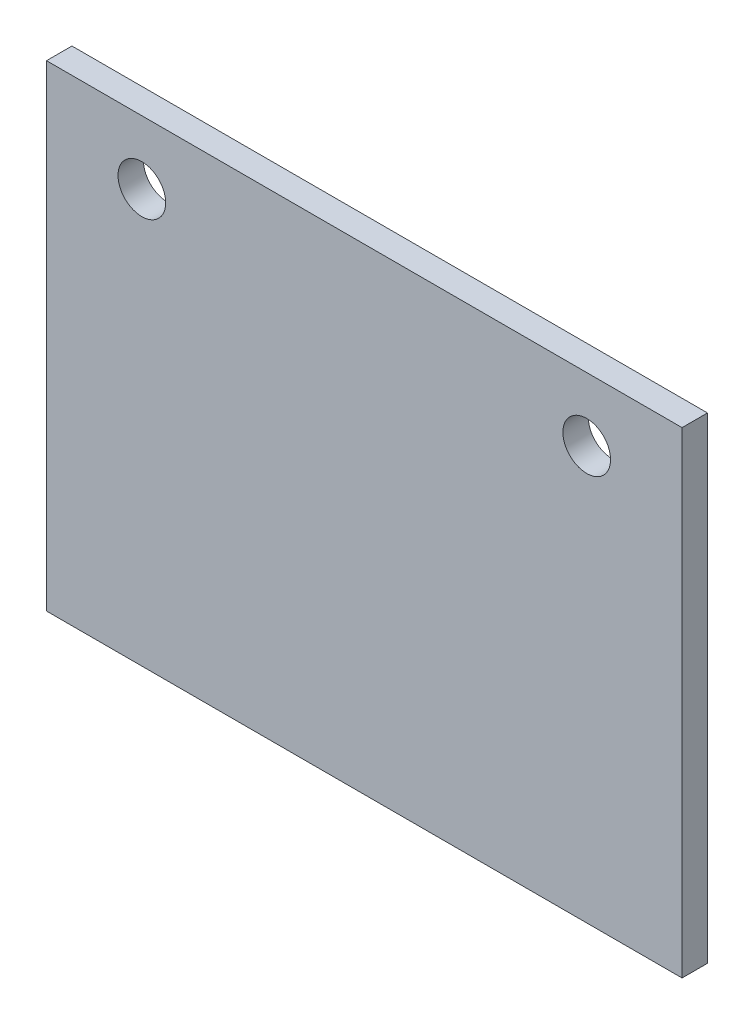
ISO-10303-21;
HEADER;
FILE_DESCRIPTION(('STEP AP214'),'2;1');
FILE_NAME('part.step','',(''),(''),'','','');
FILE_SCHEMA(('AUTOMOTIVE_DESIGN { 1 0 10303 214 1 1 1 1 }'));
ENDSEC;
DATA;
#1=APPLICATION_CONTEXT('core data for automotive mechanical design processes');
#2=APPLICATION_PROTOCOL_DEFINITION('international standard','automotive_design',2000,#1);
#3=PRODUCT_CONTEXT('',#1,'mechanical');
#4=PRODUCT('Part','Part','',(#3));
#5=PRODUCT_RELATED_PRODUCT_CATEGORY('part','',(#4));
#6=PRODUCT_DEFINITION_FORMATION('','',#4);
#7=PRODUCT_DEFINITION_CONTEXT('part definition',#1,'design');
#8=PRODUCT_DEFINITION('design','',#6,#7);
#9=PRODUCT_DEFINITION_SHAPE('','',#8);
#10=(LENGTH_UNIT() NAMED_UNIT(*) SI_UNIT(.MILLI.,.METRE.));
#11=(NAMED_UNIT(*) PLANE_ANGLE_UNIT() SI_UNIT($,.RADIAN.));
#12=(NAMED_UNIT(*) SI_UNIT($,.STERADIAN.) SOLID_ANGLE_UNIT());
#13=UNCERTAINTY_MEASURE_WITH_UNIT(LENGTH_MEASURE(1.E-05),#10,'distance_accuracy_value','');
#14=(GEOMETRIC_REPRESENTATION_CONTEXT(3) GLOBAL_UNCERTAINTY_ASSIGNED_CONTEXT((#13)) GLOBAL_UNIT_ASSIGNED_CONTEXT((#10,
#11,#12)) REPRESENTATION_CONTEXT('',''));
#15=CARTESIAN_POINT('',(0.,0.,0.));
#16=DIRECTION('',(0.,0.,1.));
#17=DIRECTION('',(1.,0.,0.));
#18=AXIS2_PLACEMENT_3D('',#15,#16,#17);
#19=CARTESIAN_POINT('',(0.,0.,1.6));
#20=DIRECTION('',(0.,0.,1.));
#21=DIRECTION('',(1.,0.,0.));
#22=AXIS2_PLACEMENT_3D('',#19,#20,#21);
#23=PLANE('',#22);
#24=CARTESIAN_POINT('',(-14.,11.,1.6));
#25=DIRECTION('',(0.,0.,1.));
#26=DIRECTION('',(1.,0.,0.));
#27=AXIS2_PLACEMENT_3D('',#24,#25,#26);
#28=CIRCLE('',#27,1.5);
#29=CARTESIAN_POINT('',(-12.5,11.,1.6));
#30=VERTEX_POINT('',#29);
#31=EDGE_CURVE('E102',#30,#30,#28,.T.);
#32=ORIENTED_EDGE('',*,*,#31,.F.);
#33=EDGE_LOOP('',(#32));
#34=FACE_BOUND('',#33,.T.);
#35=DIRECTION('',(0.,-1.,0.));
#36=VECTOR('',#35,1.);
#37=CARTESIAN_POINT('',(-20.,-15.,1.6));
#38=LINE('',#37,#36);
#39=CARTESIAN_POINT('',(-20.,15.,1.6));
#40=VERTEX_POINT('',#39);
#41=CARTESIAN_POINT('',(-20.,-15.,1.6));
#42=VERTEX_POINT('',#41);
#43=EDGE_CURVE('E87',#40,#42,#38,.T.);
#44=ORIENTED_EDGE('',*,*,#43,.T.);
#45=DIRECTION('',(1.,0.,0.));
#46=VECTOR('',#45,1.);
#47=CARTESIAN_POINT('',(20.,-15.,1.6));
#48=LINE('',#47,#46);
#49=CARTESIAN_POINT('',(20.,-15.,1.6));
#50=VERTEX_POINT('',#49);
#51=EDGE_CURVE('E82',#42,#50,#48,.T.);
#52=ORIENTED_EDGE('',*,*,#51,.T.);
#53=DIRECTION('',(0.,1.,0.));
#54=VECTOR('',#53,1.);
#55=CARTESIAN_POINT('',(20.,-15.,1.6));
#56=LINE('',#55,#54);
#57=CARTESIAN_POINT('',(20.,15.,1.6));
#58=VERTEX_POINT('',#57);
#59=EDGE_CURVE('E85',#50,#58,#56,.T.);
#60=ORIENTED_EDGE('',*,*,#59,.T.);
#61=DIRECTION('',(-1.,0.,0.));
#62=VECTOR('',#61,1.);
#63=CARTESIAN_POINT('',(20.,15.,1.6));
#64=LINE('',#63,#62);
#65=EDGE_CURVE('E52',#58,#40,#64,.T.);
#66=ORIENTED_EDGE('',*,*,#65,.T.);
#67=EDGE_LOOP('',(#44,#52,#60,#66));
#68=FACE_BOUND('',#67,.T.);
#69=CARTESIAN_POINT('',(14.,11.,1.6));
#70=DIRECTION('',(0.,0.,1.));
#71=DIRECTION('',(-1.,0.,0.));
#72=AXIS2_PLACEMENT_3D('',#69,#70,#71);
#73=CIRCLE('',#72,1.5);
#74=CARTESIAN_POINT('',(12.5,11.,1.6));
#75=VERTEX_POINT('',#74);
#76=EDGE_CURVE('E117',#75,#75,#73,.T.);
#77=ORIENTED_EDGE('',*,*,#76,.F.);
#78=EDGE_LOOP('',(#77));
#79=FACE_BOUND('',#78,.T.);
#80=ADVANCED_FACE('F35',(#34,#68,#79),#23,.T.);
#81=CARTESIAN_POINT('',(0.,0.,0.));
#82=DIRECTION('',(0.,0.,1.));
#83=DIRECTION('',(1.,0.,0.));
#84=AXIS2_PLACEMENT_3D('',#81,#82,#83);
#85=PLANE('',#84);
#86=DIRECTION('',(0.,-1.,0.));
#87=VECTOR('',#86,1.);
#88=CARTESIAN_POINT('',(-20.,-15.,0.));
#89=LINE('',#88,#87);
#90=CARTESIAN_POINT('',(-20.,15.,0.));
#91=VERTEX_POINT('',#90);
#92=CARTESIAN_POINT('',(-20.,-15.,0.));
#93=VERTEX_POINT('',#92);
#94=EDGE_CURVE('E99',#91,#93,#89,.T.);
#95=ORIENTED_EDGE('',*,*,#94,.F.);
#96=DIRECTION('',(-1.,0.,0.));
#97=VECTOR('',#96,1.);
#98=CARTESIAN_POINT('',(20.,15.,0.));
#99=LINE('',#98,#97);
#100=CARTESIAN_POINT('',(20.,15.,0.));
#101=VERTEX_POINT('',#100);
#102=EDGE_CURVE('E75',#101,#91,#99,.T.);
#103=ORIENTED_EDGE('',*,*,#102,.F.);
#104=DIRECTION('',(0.,1.,0.));
#105=VECTOR('',#104,1.);
#106=CARTESIAN_POINT('',(20.,-15.,0.));
#107=LINE('',#106,#105);
#108=CARTESIAN_POINT('',(20.,-15.,0.));
#109=VERTEX_POINT('',#108);
#110=EDGE_CURVE('E69',#109,#101,#107,.T.);
#111=ORIENTED_EDGE('',*,*,#110,.F.);
#112=DIRECTION('',(1.,0.,0.));
#113=VECTOR('',#112,1.);
#114=CARTESIAN_POINT('',(20.,-15.,0.));
#115=LINE('',#114,#113);
#116=EDGE_CURVE('E91',#93,#109,#115,.T.);
#117=ORIENTED_EDGE('',*,*,#116,.F.);
#118=EDGE_LOOP('',(#95,#103,#111,#117));
#119=FACE_BOUND('',#118,.T.);
#120=CARTESIAN_POINT('',(-14.,11.,0.));
#121=DIRECTION('',(0.,0.,1.));
#122=DIRECTION('',(1.,0.,0.));
#123=AXIS2_PLACEMENT_3D('',#120,#121,#122);
#124=CIRCLE('',#123,1.5);
#125=CARTESIAN_POINT('',(-12.5,11.,0.));
#126=VERTEX_POINT('',#125);
#127=EDGE_CURVE('E114',#126,#126,#124,.T.);
#128=ORIENTED_EDGE('',*,*,#127,.T.);
#129=EDGE_LOOP('',(#128));
#130=FACE_BOUND('',#129,.T.);
#131=CARTESIAN_POINT('',(14.,11.,0.));
#132=DIRECTION('',(0.,0.,1.));
#133=DIRECTION('',(-1.,0.,0.));
#134=AXIS2_PLACEMENT_3D('',#131,#132,#133);
#135=CIRCLE('',#134,1.5);
#136=CARTESIAN_POINT('',(12.5,11.,0.));
#137=VERTEX_POINT('',#136);
#138=EDGE_CURVE('E120',#137,#137,#135,.T.);
#139=ORIENTED_EDGE('',*,*,#138,.T.);
#140=EDGE_LOOP('',(#139));
#141=FACE_BOUND('',#140,.T.);
#142=ADVANCED_FACE('F110',(#119,#130,#141),#85,.F.);
#143=CARTESIAN_POINT('',(-20.,-15.,1.6));
#144=DIRECTION('',(1.,0.,0.));
#145=DIRECTION('',(0.,0.,-1.));
#146=AXIS2_PLACEMENT_3D('',#143,#144,#145);
#147=PLANE('',#146);
#148=ORIENTED_EDGE('',*,*,#94,.T.);
#149=DIRECTION('',(0.,0.,-1.));
#150=VECTOR('',#149,1.);
#151=CARTESIAN_POINT('',(-20.,-15.,1.6));
#152=LINE('',#151,#150);
#153=EDGE_CURVE('E11',#42,#93,#152,.T.);
#154=ORIENTED_EDGE('',*,*,#153,.F.);
#155=ORIENTED_EDGE('',*,*,#43,.F.);
#156=DIRECTION('',(0.,0.,-1.));
#157=VECTOR('',#156,1.);
#158=CARTESIAN_POINT('',(-20.,15.,1.6));
#159=LINE('',#158,#157);
#160=EDGE_CURVE('E95',#40,#91,#159,.T.);
#161=ORIENTED_EDGE('',*,*,#160,.T.);
#162=EDGE_LOOP('',(#148,#154,#155,#161));
#163=FACE_BOUND('',#162,.T.);
#164=ADVANCED_FACE('F37',(#163),#147,.F.);
#165=CARTESIAN_POINT('',(20.,-15.,1.6));
#166=DIRECTION('',(0.,1.,0.));
#167=DIRECTION('',(0.,0.,1.));
#168=AXIS2_PLACEMENT_3D('',#165,#166,#167);
#169=PLANE('',#168);
#170=ORIENTED_EDGE('',*,*,#116,.T.);
#171=DIRECTION('',(0.,0.,-1.));
#172=VECTOR('',#171,1.);
#173=CARTESIAN_POINT('',(20.,-15.,1.6));
#174=LINE('',#173,#172);
#175=EDGE_CURVE('E44',#50,#109,#174,.T.);
#176=ORIENTED_EDGE('',*,*,#175,.F.);
#177=ORIENTED_EDGE('',*,*,#51,.F.);
#178=ORIENTED_EDGE('',*,*,#153,.T.);
#179=EDGE_LOOP('',(#170,#176,#177,#178));
#180=FACE_BOUND('',#179,.T.);
#181=ADVANCED_FACE('F90',(#180),#169,.F.);
#182=CARTESIAN_POINT('',(20.,-15.,1.6));
#183=DIRECTION('',(-1.,0.,0.));
#184=DIRECTION('',(0.,0.,1.));
#185=AXIS2_PLACEMENT_3D('',#182,#183,#184);
#186=PLANE('',#185);
#187=ORIENTED_EDGE('',*,*,#110,.T.);
#188=DIRECTION('',(0.,0.,-1.));
#189=VECTOR('',#188,1.);
#190=CARTESIAN_POINT('',(20.,15.,1.6));
#191=LINE('',#190,#189);
#192=EDGE_CURVE('E92',#58,#101,#191,.T.);
#193=ORIENTED_EDGE('',*,*,#192,.F.);
#194=ORIENTED_EDGE('',*,*,#59,.F.);
#195=ORIENTED_EDGE('',*,*,#175,.T.);
#196=EDGE_LOOP('',(#187,#193,#194,#195));
#197=FACE_BOUND('',#196,.T.);
#198=ADVANCED_FACE('F93',(#197),#186,.F.);
#199=CARTESIAN_POINT('',(20.,15.,1.6));
#200=DIRECTION('',(0.,-1.,0.));
#201=DIRECTION('',(1.,0.,0.));
#202=AXIS2_PLACEMENT_3D('',#199,#200,#201);
#203=PLANE('',#202);
#204=ORIENTED_EDGE('',*,*,#102,.T.);
#205=ORIENTED_EDGE('',*,*,#160,.F.);
#206=ORIENTED_EDGE('',*,*,#65,.F.);
#207=ORIENTED_EDGE('',*,*,#192,.T.);
#208=EDGE_LOOP('',(#204,#205,#206,#207));
#209=FACE_BOUND('',#208,.T.);
#210=ADVANCED_FACE('F107',(#209),#203,.F.);
#211=CARTESIAN_POINT('',(-14.,11.,1.6));
#212=DIRECTION('',(0.,0.,-1.));
#213=DIRECTION('',(-1.,0.,0.));
#214=AXIS2_PLACEMENT_3D('',#211,#212,#213);
#215=CYLINDRICAL_SURFACE('',#214,1.5);
#216=ORIENTED_EDGE('',*,*,#31,.T.);
#217=EDGE_LOOP('',(#216));
#218=FACE_BOUND('',#217,.T.);
#219=ORIENTED_EDGE('',*,*,#127,.F.);
#220=EDGE_LOOP('',(#219));
#221=FACE_BOUND('',#220,.T.);
#222=ADVANCED_FACE('F137',(#218,#221),#215,.F.);
#223=CARTESIAN_POINT('',(14.,11.,1.6));
#224=DIRECTION('',(0.,0.,-1.));
#225=DIRECTION('',(-1.,0.,0.));
#226=AXIS2_PLACEMENT_3D('',#223,#224,#225);
#227=CYLINDRICAL_SURFACE('',#226,1.5);
#228=ORIENTED_EDGE('',*,*,#76,.T.);
#229=EDGE_LOOP('',(#228));
#230=FACE_BOUND('',#229,.T.);
#231=ORIENTED_EDGE('',*,*,#138,.F.);
#232=EDGE_LOOP('',(#231));
#233=FACE_BOUND('',#232,.T.);
#234=ADVANCED_FACE('F126',(#230,#233),#227,.F.);
#235=CLOSED_SHELL('',(#80,#142,#164,#181,#198,#210,#222,#234));
#236=MANIFOLD_SOLID_BREP('B2',#235);
#237=ADVANCED_BREP_SHAPE_REPRESENTATION('',(#18,#236),#14);
#238=SHAPE_DEFINITION_REPRESENTATION(#9,#237);
ENDSEC;
END-ISO-10303-21;
